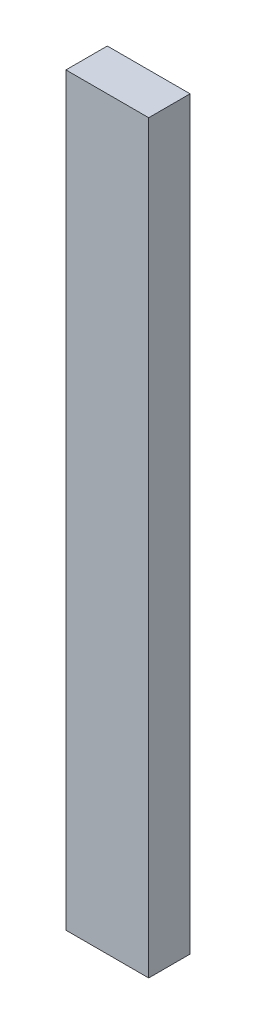
ISO-10303-21;
HEADER;
FILE_DESCRIPTION(('STEP AP214'),'2;1');
FILE_NAME('part.step','',(''),(''),'','','');
FILE_SCHEMA(('AUTOMOTIVE_DESIGN { 1 0 10303 214 1 1 1 1 }'));
ENDSEC;
DATA;
#1=APPLICATION_CONTEXT('core data for automotive mechanical design processes');
#2=APPLICATION_PROTOCOL_DEFINITION('international standard','automotive_design',2000,#1);
#3=PRODUCT_CONTEXT('',#1,'mechanical');
#4=PRODUCT('Part','Part','',(#3));
#5=PRODUCT_RELATED_PRODUCT_CATEGORY('part','',(#4));
#6=PRODUCT_DEFINITION_FORMATION('','',#4);
#7=PRODUCT_DEFINITION_CONTEXT('part definition',#1,'design');
#8=PRODUCT_DEFINITION('design','',#6,#7);
#9=PRODUCT_DEFINITION_SHAPE('','',#8);
#10=(LENGTH_UNIT() NAMED_UNIT(*) SI_UNIT(.MILLI.,.METRE.));
#11=(NAMED_UNIT(*) PLANE_ANGLE_UNIT() SI_UNIT($,.RADIAN.));
#12=(NAMED_UNIT(*) SI_UNIT($,.STERADIAN.) SOLID_ANGLE_UNIT());
#13=UNCERTAINTY_MEASURE_WITH_UNIT(LENGTH_MEASURE(1.E-05),#10,'distance_accuracy_value','');
#14=(GEOMETRIC_REPRESENTATION_CONTEXT(3) GLOBAL_UNCERTAINTY_ASSIGNED_CONTEXT((#13)) GLOBAL_UNIT_ASSIGNED_CONTEXT((#10,
#11,#12)) REPRESENTATION_CONTEXT('',''));
#15=CARTESIAN_POINT('',(0.,0.,0.));
#16=DIRECTION('',(0.,0.,1.));
#17=DIRECTION('',(1.,0.,0.));
#18=AXIS2_PLACEMENT_3D('',#15,#16,#17);
#19=CARTESIAN_POINT('',(12.7,-114.3,12.7));
#20=DIRECTION('',(-1.,0.,0.));
#21=DIRECTION('',(0.,0.,1.));
#22=AXIS2_PLACEMENT_3D('',#19,#20,#21);
#23=PLANE('',#22);
#24=DIRECTION('',(0.,1.,0.));
#25=VECTOR('',#24,1.);
#26=CARTESIAN_POINT('',(12.7,-114.3,0.));
#27=LINE('',#26,#25);
#28=CARTESIAN_POINT('',(12.7,-114.3,0.));
#29=VERTEX_POINT('',#28);
#30=CARTESIAN_POINT('',(12.7,114.3,0.));
#31=VERTEX_POINT('',#30);
#32=EDGE_CURVE('E96',#29,#31,#27,.T.);
#33=ORIENTED_EDGE('',*,*,#32,.T.);
#34=DIRECTION('',(0.,0.,-1.));
#35=VECTOR('',#34,1.);
#36=CARTESIAN_POINT('',(12.7,114.3,12.7));
#37=LINE('',#36,#35);
#38=CARTESIAN_POINT('',(12.7,114.3,12.7));
#39=VERTEX_POINT('',#38);
#40=EDGE_CURVE('E11',#39,#31,#37,.T.);
#41=ORIENTED_EDGE('',*,*,#40,.F.);
#42=DIRECTION('',(0.,1.,0.));
#43=VECTOR('',#42,1.);
#44=CARTESIAN_POINT('',(12.7,-114.3,12.7));
#45=LINE('',#44,#43);
#46=CARTESIAN_POINT('',(12.7,-114.3,12.7));
#47=VERTEX_POINT('',#46);
#48=EDGE_CURVE('E84',#47,#39,#45,.T.);
#49=ORIENTED_EDGE('',*,*,#48,.F.);
#50=DIRECTION('',(0.,0.,-1.));
#51=VECTOR('',#50,1.);
#52=CARTESIAN_POINT('',(12.7,-114.3,12.7));
#53=LINE('',#52,#51);
#54=EDGE_CURVE('E92',#47,#29,#53,.T.);
#55=ORIENTED_EDGE('',*,*,#54,.T.);
#56=EDGE_LOOP('',(#33,#41,#49,#55));
#57=FACE_BOUND('',#56,.T.);
#58=ADVANCED_FACE('F33',(#57),#23,.F.);
#59=CARTESIAN_POINT('',(-12.7,114.3,12.7));
#60=DIRECTION('',(0.,-1.,0.));
#61=DIRECTION('',(0.,0.,-1.));
#62=AXIS2_PLACEMENT_3D('',#59,#60,#61);
#63=PLANE('',#62);
#64=DIRECTION('',(-1.,0.,0.));
#65=VECTOR('',#64,1.);
#66=CARTESIAN_POINT('',(-12.7,114.3,0.));
#67=LINE('',#66,#65);
#68=CARTESIAN_POINT('',(-12.7,114.3,0.));
#69=VERTEX_POINT('',#68);
#70=EDGE_CURVE('E88',#31,#69,#67,.T.);
#71=ORIENTED_EDGE('',*,*,#70,.T.);
#72=DIRECTION('',(0.,0.,-1.));
#73=VECTOR('',#72,1.);
#74=CARTESIAN_POINT('',(-12.7,114.3,12.7));
#75=LINE('',#74,#73);
#76=CARTESIAN_POINT('',(-12.7,114.3,12.7));
#77=VERTEX_POINT('',#76);
#78=EDGE_CURVE('E41',#77,#69,#75,.T.);
#79=ORIENTED_EDGE('',*,*,#78,.F.);
#80=DIRECTION('',(-1.,0.,0.));
#81=VECTOR('',#80,1.);
#82=CARTESIAN_POINT('',(-12.7,114.3,12.7));
#83=LINE('',#82,#81);
#84=EDGE_CURVE('E79',#39,#77,#83,.T.);
#85=ORIENTED_EDGE('',*,*,#84,.F.);
#86=ORIENTED_EDGE('',*,*,#40,.T.);
#87=EDGE_LOOP('',(#71,#79,#85,#86));
#88=FACE_BOUND('',#87,.T.);
#89=ADVANCED_FACE('F87',(#88),#63,.F.);
#90=CARTESIAN_POINT('',(-12.7,-114.3,12.7));
#91=DIRECTION('',(1.,0.,0.));
#92=DIRECTION('',(0.,0.,-1.));
#93=AXIS2_PLACEMENT_3D('',#90,#91,#92);
#94=PLANE('',#93);
#95=DIRECTION('',(0.,-1.,0.));
#96=VECTOR('',#95,1.);
#97=CARTESIAN_POINT('',(-12.7,-114.3,0.));
#98=LINE('',#97,#96);
#99=CARTESIAN_POINT('',(-12.7,-114.3,0.));
#100=VERTEX_POINT('',#99);
#101=EDGE_CURVE('E66',#69,#100,#98,.T.);
#102=ORIENTED_EDGE('',*,*,#101,.T.);
#103=DIRECTION('',(0.,0.,-1.));
#104=VECTOR('',#103,1.);
#105=CARTESIAN_POINT('',(-12.7,-114.3,12.7));
#106=LINE('',#105,#104);
#107=CARTESIAN_POINT('',(-12.7,-114.3,12.7));
#108=VERTEX_POINT('',#107);
#109=EDGE_CURVE('E89',#108,#100,#106,.T.);
#110=ORIENTED_EDGE('',*,*,#109,.F.);
#111=DIRECTION('',(0.,-1.,0.));
#112=VECTOR('',#111,1.);
#113=CARTESIAN_POINT('',(-12.7,-114.3,12.7));
#114=LINE('',#113,#112);
#115=EDGE_CURVE('E82',#77,#108,#114,.T.);
#116=ORIENTED_EDGE('',*,*,#115,.F.);
#117=ORIENTED_EDGE('',*,*,#78,.T.);
#118=EDGE_LOOP('',(#102,#110,#116,#117));
#119=FACE_BOUND('',#118,.T.);
#120=ADVANCED_FACE('F90',(#119),#94,.F.);
#121=CARTESIAN_POINT('',(-12.7,-114.3,12.7));
#122=DIRECTION('',(0.,1.,0.));
#123=DIRECTION('',(0.,0.,1.));
#124=AXIS2_PLACEMENT_3D('',#121,#122,#123);
#125=PLANE('',#124);
#126=DIRECTION('',(1.,0.,0.));
#127=VECTOR('',#126,1.);
#128=CARTESIAN_POINT('',(-12.7,-114.3,0.));
#129=LINE('',#128,#127);
#130=EDGE_CURVE('E72',#100,#29,#129,.T.);
#131=ORIENTED_EDGE('',*,*,#130,.T.);
#132=ORIENTED_EDGE('',*,*,#54,.F.);
#133=DIRECTION('',(1.,0.,0.));
#134=VECTOR('',#133,1.);
#135=CARTESIAN_POINT('',(-12.7,-114.3,12.7));
#136=LINE('',#135,#134);
#137=EDGE_CURVE('E49',#108,#47,#136,.T.);
#138=ORIENTED_EDGE('',*,*,#137,.F.);
#139=ORIENTED_EDGE('',*,*,#109,.T.);
#140=EDGE_LOOP('',(#131,#132,#138,#139));
#141=FACE_BOUND('',#140,.T.);
#142=ADVANCED_FACE('F103',(#141),#125,.F.);
#143=CARTESIAN_POINT('',(0.,0.,12.7));
#144=DIRECTION('',(0.,0.,-1.));
#145=DIRECTION('',(-1.,0.,0.));
#146=AXIS2_PLACEMENT_3D('',#143,#144,#145);
#147=PLANE('',#146);
#148=ORIENTED_EDGE('',*,*,#48,.T.);
#149=ORIENTED_EDGE('',*,*,#84,.T.);
#150=ORIENTED_EDGE('',*,*,#115,.T.);
#151=ORIENTED_EDGE('',*,*,#137,.T.);
#152=EDGE_LOOP('',(#148,#149,#150,#151));
#153=FACE_BOUND('',#152,.T.);
#154=ADVANCED_FACE('F80',(#153),#147,.F.);
#155=CARTESIAN_POINT('',(0.,0.,0.));
#156=DIRECTION('',(0.,0.,-1.));
#157=DIRECTION('',(-1.,0.,0.));
#158=AXIS2_PLACEMENT_3D('',#155,#156,#157);
#159=PLANE('',#158);
#160=ORIENTED_EDGE('',*,*,#32,.F.);
#161=ORIENTED_EDGE('',*,*,#130,.F.);
#162=ORIENTED_EDGE('',*,*,#101,.F.);
#163=ORIENTED_EDGE('',*,*,#70,.F.);
#164=EDGE_LOOP('',(#160,#161,#162,#163));
#165=FACE_BOUND('',#164,.T.);
#166=ADVANCED_FACE('F106',(#165),#159,.T.);
#167=CLOSED_SHELL('',(#58,#89,#120,#142,#154,#166));
#168=MANIFOLD_SOLID_BREP('B2',#167);
#169=ADVANCED_BREP_SHAPE_REPRESENTATION('',(#18,#168),#14);
#170=SHAPE_DEFINITION_REPRESENTATION(#9,#169);
ENDSEC;
END-ISO-10303-21;
